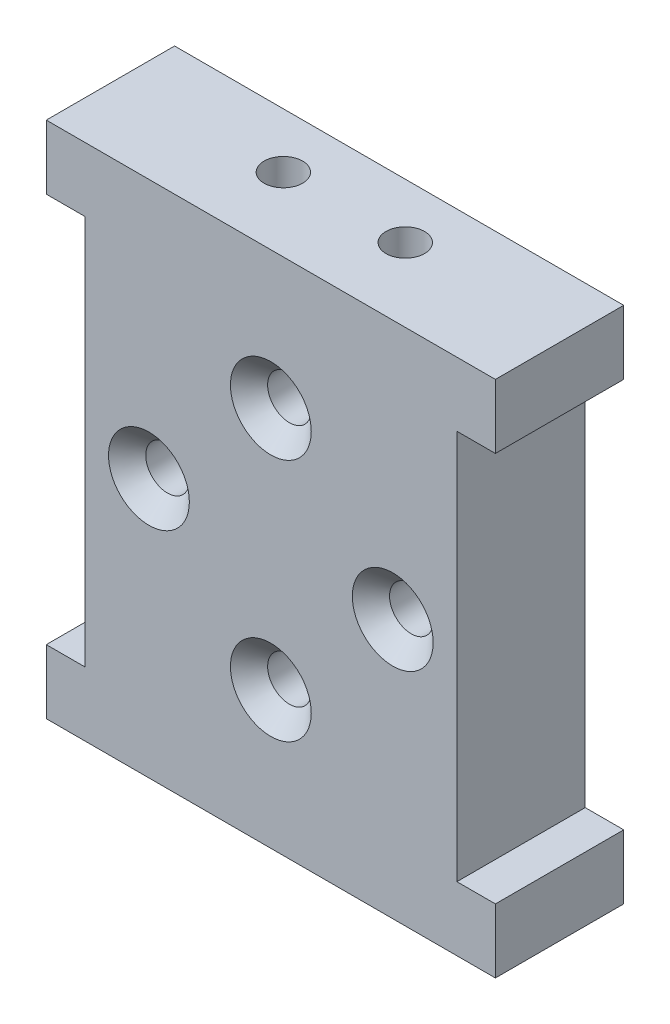
ISO-10303-21;
HEADER;
FILE_DESCRIPTION(('STEP AP214'),'2;1');
FILE_NAME('part.step','',(''),(''),'','','');
FILE_SCHEMA(('AUTOMOTIVE_DESIGN { 1 0 10303 214 1 1 1 1 }'));
ENDSEC;
DATA;
#1=APPLICATION_CONTEXT('core data for automotive mechanical design processes');
#2=APPLICATION_PROTOCOL_DEFINITION('international standard','automotive_design',2000,#1);
#3=PRODUCT_CONTEXT('',#1,'mechanical');
#4=PRODUCT('Part','Part','',(#3));
#5=PRODUCT_RELATED_PRODUCT_CATEGORY('part','',(#4));
#6=PRODUCT_DEFINITION_FORMATION('','',#4);
#7=PRODUCT_DEFINITION_CONTEXT('part definition',#1,'design');
#8=PRODUCT_DEFINITION('design','',#6,#7);
#9=PRODUCT_DEFINITION_SHAPE('','',#8);
#10=(LENGTH_UNIT() NAMED_UNIT(*) SI_UNIT(.MILLI.,.METRE.));
#11=(NAMED_UNIT(*) PLANE_ANGLE_UNIT() SI_UNIT($,.RADIAN.));
#12=(NAMED_UNIT(*) SI_UNIT($,.STERADIAN.) SOLID_ANGLE_UNIT());
#13=UNCERTAINTY_MEASURE_WITH_UNIT(LENGTH_MEASURE(1.E-05),#10,'distance_accuracy_value','');
#14=(GEOMETRIC_REPRESENTATION_CONTEXT(3) GLOBAL_UNCERTAINTY_ASSIGNED_CONTEXT((#13)) GLOBAL_UNIT_ASSIGNED_CONTEXT((#10,
#11,#12)) REPRESENTATION_CONTEXT('',''));
#15=CARTESIAN_POINT('',(0.,0.,0.));
#16=DIRECTION('',(0.,0.,1.));
#17=DIRECTION('',(1.,0.,0.));
#18=AXIS2_PLACEMENT_3D('',#15,#16,#17);
#19=CARTESIAN_POINT('',(-17.5,20.2,5.));
#20=DIRECTION('',(0.,-1.,0.));
#21=DIRECTION('',(1.,0.,0.));
#22=AXIS2_PLACEMENT_3D('',#19,#20,#21);
#23=PLANE('',#22);
#24=DIRECTION('',(-1.,0.,0.));
#25=VECTOR('',#24,1.);
#26=CARTESIAN_POINT('',(-17.5,20.2,-5.));
#27=LINE('',#26,#25);
#28=CARTESIAN_POINT('',(17.5,20.2,-5.));
#29=VERTEX_POINT('',#28);
#30=CARTESIAN_POINT('',(-17.5,20.2,-5.));
#31=VERTEX_POINT('',#30);
#32=EDGE_CURVE('E168',#29,#31,#27,.T.);
#33=ORIENTED_EDGE('',*,*,#32,.T.);
#34=DIRECTION('',(0.,0.,-1.));
#35=VECTOR('',#34,1.);
#36=CARTESIAN_POINT('',(-17.5,20.2,5.));
#37=LINE('',#36,#35);
#38=CARTESIAN_POINT('',(-17.5,20.2,5.));
#39=VERTEX_POINT('',#38);
#40=EDGE_CURVE('E194',#39,#31,#37,.T.);
#41=ORIENTED_EDGE('',*,*,#40,.F.);
#42=DIRECTION('',(-1.,0.,0.));
#43=VECTOR('',#42,1.);
#44=CARTESIAN_POINT('',(-17.5,20.2,5.));
#45=LINE('',#44,#43);
#46=CARTESIAN_POINT('',(17.5,20.2,5.));
#47=VERTEX_POINT('',#46);
#48=EDGE_CURVE('E241',#47,#39,#45,.T.);
#49=ORIENTED_EDGE('',*,*,#48,.F.);
#50=DIRECTION('',(0.,0.,-1.));
#51=VECTOR('',#50,1.);
#52=CARTESIAN_POINT('',(17.5,20.2,5.));
#53=LINE('',#52,#51);
#54=EDGE_CURVE('E197',#47,#29,#53,.T.);
#55=ORIENTED_EDGE('',*,*,#54,.T.);
#56=EDGE_LOOP('',(#33,#41,#49,#55));
#57=FACE_BOUND('',#56,.T.);
#58=CARTESIAN_POINT('',(4.74999999999999,20.2,-0.725000000000035));
#59=DIRECTION('',(0.,1.,0.));
#60=DIRECTION('',(0.,0.,1.));
#61=AXIS2_PLACEMENT_3D('',#58,#59,#60);
#62=CIRCLE('',#61,1.5);
#63=CARTESIAN_POINT('',(4.74999999999999,20.2,0.774999999999961));
#64=VERTEX_POINT('',#63);
#65=EDGE_CURVE('E425',#64,#64,#62,.T.);
#66=ORIENTED_EDGE('',*,*,#65,.F.);
#67=EDGE_LOOP('',(#66));
#68=FACE_BOUND('',#67,.T.);
#69=CARTESIAN_POINT('',(-4.75,20.2,-0.725000000000002));
#70=DIRECTION('',(0.,1.,0.));
#71=DIRECTION('',(0.,0.,1.));
#72=AXIS2_PLACEMENT_3D('',#69,#70,#71);
#73=CIRCLE('',#72,1.5);
#74=CARTESIAN_POINT('',(-4.75,20.2,0.774999999999994));
#75=VERTEX_POINT('',#74);
#76=EDGE_CURVE('E431',#75,#75,#73,.T.);
#77=ORIENTED_EDGE('',*,*,#76,.F.);
#78=EDGE_LOOP('',(#77));
#79=FACE_BOUND('',#78,.T.);
#80=ADVANCED_FACE('F35',(#57,#68,#79),#23,.F.);
#81=CARTESIAN_POINT('',(14.5,-15.2,5.));
#82=DIRECTION('',(0.,-1.,0.));
#83=DIRECTION('',(1.,0.,0.));
#84=AXIS2_PLACEMENT_3D('',#81,#82,#83);
#85=PLANE('',#84);
#86=DIRECTION('',(-1.,0.,0.));
#87=VECTOR('',#86,1.);
#88=CARTESIAN_POINT('',(14.5,-15.2,-5.));
#89=LINE('',#88,#87);
#90=CARTESIAN_POINT('',(17.5,-15.2,-5.));
#91=VERTEX_POINT('',#90);
#92=CARTESIAN_POINT('',(14.5,-15.2,-5.));
#93=VERTEX_POINT('',#92);
#94=EDGE_CURVE('E158',#91,#93,#89,.T.);
#95=ORIENTED_EDGE('',*,*,#94,.T.);
#96=DIRECTION('',(0.,0.,-1.));
#97=VECTOR('',#96,1.);
#98=CARTESIAN_POINT('',(14.5,-15.2,5.));
#99=LINE('',#98,#97);
#100=CARTESIAN_POINT('',(14.5,-15.2,5.));
#101=VERTEX_POINT('',#100);
#102=EDGE_CURVE('E11',#101,#93,#99,.T.);
#103=ORIENTED_EDGE('',*,*,#102,.F.);
#104=DIRECTION('',(-1.,0.,0.));
#105=VECTOR('',#104,1.);
#106=CARTESIAN_POINT('',(14.5,-15.2,5.));
#107=LINE('',#106,#105);
#108=CARTESIAN_POINT('',(17.5,-15.2,5.));
#109=VERTEX_POINT('',#108);
#110=EDGE_CURVE('E181',#109,#101,#107,.T.);
#111=ORIENTED_EDGE('',*,*,#110,.F.);
#112=DIRECTION('',(0.,0.,-1.));
#113=VECTOR('',#112,1.);
#114=CARTESIAN_POINT('',(17.5,-15.2,5.));
#115=LINE('',#114,#113);
#116=EDGE_CURVE('E154',#109,#91,#115,.T.);
#117=ORIENTED_EDGE('',*,*,#116,.T.);
#118=EDGE_LOOP('',(#95,#103,#111,#117));
#119=FACE_BOUND('',#118,.T.);
#120=ADVANCED_FACE('F37',(#119),#85,.F.);
#121=CARTESIAN_POINT('',(14.5,-15.2,5.));
#122=DIRECTION('',(-1.,0.,0.));
#123=DIRECTION('',(0.,-1.,0.));
#124=AXIS2_PLACEMENT_3D('',#121,#122,#123);
#125=PLANE('',#124);
#126=DIRECTION('',(0.,1.,0.));
#127=VECTOR('',#126,1.);
#128=CARTESIAN_POINT('',(14.5,-15.2,-5.));
#129=LINE('',#128,#127);
#130=CARTESIAN_POINT('',(14.5,15.2,-5.));
#131=VERTEX_POINT('',#130);
#132=EDGE_CURVE('E161',#93,#131,#129,.T.);
#133=ORIENTED_EDGE('',*,*,#132,.T.);
#134=DIRECTION('',(0.,0.,-1.));
#135=VECTOR('',#134,1.);
#136=CARTESIAN_POINT('',(14.5,15.2,5.));
#137=LINE('',#136,#135);
#138=CARTESIAN_POINT('',(14.5,15.2,5.));
#139=VERTEX_POINT('',#138);
#140=EDGE_CURVE('E45',#139,#131,#137,.T.);
#141=ORIENTED_EDGE('',*,*,#140,.F.);
#142=DIRECTION('',(0.,1.,0.));
#143=VECTOR('',#142,1.);
#144=CARTESIAN_POINT('',(14.5,-15.2,5.));
#145=LINE('',#144,#143);
#146=EDGE_CURVE('E109',#101,#139,#145,.T.);
#147=ORIENTED_EDGE('',*,*,#146,.F.);
#148=ORIENTED_EDGE('',*,*,#102,.T.);
#149=EDGE_LOOP('',(#133,#141,#147,#148));
#150=FACE_BOUND('',#149,.T.);
#151=ADVANCED_FACE('F283',(#150),#125,.F.);
#152=CARTESIAN_POINT('',(14.5,15.2,5.));
#153=DIRECTION('',(0.,1.,0.));
#154=DIRECTION('',(0.,0.,1.));
#155=AXIS2_PLACEMENT_3D('',#152,#153,#154);
#156=PLANE('',#155);
#157=DIRECTION('',(1.,0.,0.));
#158=VECTOR('',#157,1.);
#159=CARTESIAN_POINT('',(14.5,15.2,-5.));
#160=LINE('',#159,#158);
#161=CARTESIAN_POINT('',(17.5,15.2,-5.));
#162=VERTEX_POINT('',#161);
#163=EDGE_CURVE('E164',#131,#162,#160,.T.);
#164=ORIENTED_EDGE('',*,*,#163,.T.);
#165=DIRECTION('',(0.,0.,-1.));
#166=VECTOR('',#165,1.);
#167=CARTESIAN_POINT('',(17.5,15.2,5.));
#168=LINE('',#167,#166);
#169=CARTESIAN_POINT('',(17.5,15.2,5.));
#170=VERTEX_POINT('',#169);
#171=EDGE_CURVE('E200',#170,#162,#168,.T.);
#172=ORIENTED_EDGE('',*,*,#171,.F.);
#173=DIRECTION('',(1.,0.,0.));
#174=VECTOR('',#173,1.);
#175=CARTESIAN_POINT('',(14.5,15.2,5.));
#176=LINE('',#175,#174);
#177=EDGE_CURVE('E237',#139,#170,#176,.T.);
#178=ORIENTED_EDGE('',*,*,#177,.F.);
#179=ORIENTED_EDGE('',*,*,#140,.T.);
#180=EDGE_LOOP('',(#164,#172,#178,#179));
#181=FACE_BOUND('',#180,.T.);
#182=ADVANCED_FACE('F292',(#181),#156,.F.);
#183=CARTESIAN_POINT('',(17.5,15.2,5.));
#184=DIRECTION('',(-1.,0.,0.));
#185=DIRECTION('',(0.,-1.,0.));
#186=AXIS2_PLACEMENT_3D('',#183,#184,#185);
#187=PLANE('',#186);
#188=DIRECTION('',(0.,1.,0.));
#189=VECTOR('',#188,1.);
#190=CARTESIAN_POINT('',(17.5,15.2,-5.));
#191=LINE('',#190,#189);
#192=EDGE_CURVE('E166',#162,#29,#191,.T.);
#193=ORIENTED_EDGE('',*,*,#192,.T.);
#194=ORIENTED_EDGE('',*,*,#54,.F.);
#195=DIRECTION('',(0.,1.,0.));
#196=VECTOR('',#195,1.);
#197=CARTESIAN_POINT('',(17.5,15.2,5.));
#198=LINE('',#197,#196);
#199=EDGE_CURVE('E239',#170,#47,#198,.T.);
#200=ORIENTED_EDGE('',*,*,#199,.F.);
#201=ORIENTED_EDGE('',*,*,#171,.T.);
#202=EDGE_LOOP('',(#193,#194,#200,#201));
#203=FACE_BOUND('',#202,.T.);
#204=ADVANCED_FACE('F289',(#203),#187,.F.);
#205=CARTESIAN_POINT('',(-17.5,15.2,5.));
#206=DIRECTION('',(1.,0.,0.));
#207=DIRECTION('',(0.,0.,-1.));
#208=AXIS2_PLACEMENT_3D('',#205,#206,#207);
#209=PLANE('',#208);
#210=DIRECTION('',(0.,-1.,0.));
#211=VECTOR('',#210,1.);
#212=CARTESIAN_POINT('',(-17.5,15.2,-5.));
#213=LINE('',#212,#211);
#214=CARTESIAN_POINT('',(-17.5,15.2,-5.));
#215=VERTEX_POINT('',#214);
#216=EDGE_CURVE('E170',#31,#215,#213,.T.);
#217=ORIENTED_EDGE('',*,*,#216,.T.);
#218=DIRECTION('',(0.,0.,-1.));
#219=VECTOR('',#218,1.);
#220=CARTESIAN_POINT('',(-17.5,15.2,5.));
#221=LINE('',#220,#219);
#222=CARTESIAN_POINT('',(-17.5,15.2,5.));
#223=VERTEX_POINT('',#222);
#224=EDGE_CURVE('E191',#223,#215,#221,.T.);
#225=ORIENTED_EDGE('',*,*,#224,.F.);
#226=DIRECTION('',(0.,-1.,0.));
#227=VECTOR('',#226,1.);
#228=CARTESIAN_POINT('',(-17.5,15.2,5.));
#229=LINE('',#228,#227);
#230=EDGE_CURVE('E243',#39,#223,#229,.T.);
#231=ORIENTED_EDGE('',*,*,#230,.F.);
#232=ORIENTED_EDGE('',*,*,#40,.T.);
#233=EDGE_LOOP('',(#217,#225,#231,#232));
#234=FACE_BOUND('',#233,.T.);
#235=ADVANCED_FACE('F287',(#234),#209,.F.);
#236=CARTESIAN_POINT('',(-14.5,15.2,5.));
#237=DIRECTION('',(0.,1.,0.));
#238=DIRECTION('',(-1.,0.,0.));
#239=AXIS2_PLACEMENT_3D('',#236,#237,#238);
#240=PLANE('',#239);
#241=DIRECTION('',(1.,0.,0.));
#242=VECTOR('',#241,1.);
#243=CARTESIAN_POINT('',(-14.5,15.2,-5.));
#244=LINE('',#243,#242);
#245=CARTESIAN_POINT('',(-14.5,15.2,-5.));
#246=VERTEX_POINT('',#245);
#247=EDGE_CURVE('E172',#215,#246,#244,.T.);
#248=ORIENTED_EDGE('',*,*,#247,.T.);
#249=DIRECTION('',(0.,0.,-1.));
#250=VECTOR('',#249,1.);
#251=CARTESIAN_POINT('',(-14.5,15.2,5.));
#252=LINE('',#251,#250);
#253=CARTESIAN_POINT('',(-14.5,15.2,5.));
#254=VERTEX_POINT('',#253);
#255=EDGE_CURVE('E188',#254,#246,#252,.T.);
#256=ORIENTED_EDGE('',*,*,#255,.F.);
#257=DIRECTION('',(1.,0.,0.));
#258=VECTOR('',#257,1.);
#259=CARTESIAN_POINT('',(-14.5,15.2,5.));
#260=LINE('',#259,#258);
#261=EDGE_CURVE('E245',#223,#254,#260,.T.);
#262=ORIENTED_EDGE('',*,*,#261,.F.);
#263=ORIENTED_EDGE('',*,*,#224,.T.);
#264=EDGE_LOOP('',(#248,#256,#262,#263));
#265=FACE_BOUND('',#264,.T.);
#266=ADVANCED_FACE('F313',(#265),#240,.F.);
#267=CARTESIAN_POINT('',(-14.5,-15.2,5.));
#268=DIRECTION('',(1.,0.,0.));
#269=DIRECTION('',(0.,1.,0.));
#270=AXIS2_PLACEMENT_3D('',#267,#268,#269);
#271=PLANE('',#270);
#272=DIRECTION('',(0.,-1.,0.));
#273=VECTOR('',#272,1.);
#274=CARTESIAN_POINT('',(-14.5,-15.2,-5.));
#275=LINE('',#274,#273);
#276=CARTESIAN_POINT('',(-14.5,-15.2,-5.));
#277=VERTEX_POINT('',#276);
#278=EDGE_CURVE('E174',#246,#277,#275,.T.);
#279=ORIENTED_EDGE('',*,*,#278,.T.);
#280=DIRECTION('',(0.,0.,-1.));
#281=VECTOR('',#280,1.);
#282=CARTESIAN_POINT('',(-14.5,-15.2,5.));
#283=LINE('',#282,#281);
#284=CARTESIAN_POINT('',(-14.5,-15.2,5.));
#285=VERTEX_POINT('',#284);
#286=EDGE_CURVE('E185',#285,#277,#283,.T.);
#287=ORIENTED_EDGE('',*,*,#286,.F.);
#288=DIRECTION('',(0.,-1.,0.));
#289=VECTOR('',#288,1.);
#290=CARTESIAN_POINT('',(-14.5,-15.2,5.));
#291=LINE('',#290,#289);
#292=EDGE_CURVE('E247',#254,#285,#291,.T.);
#293=ORIENTED_EDGE('',*,*,#292,.F.);
#294=ORIENTED_EDGE('',*,*,#255,.T.);
#295=EDGE_LOOP('',(#279,#287,#293,#294));
#296=FACE_BOUND('',#295,.T.);
#297=ADVANCED_FACE('F253',(#296),#271,.F.);
#298=CARTESIAN_POINT('',(-14.5,-15.2,5.));
#299=DIRECTION('',(0.,-1.,0.));
#300=DIRECTION('',(1.,0.,0.));
#301=AXIS2_PLACEMENT_3D('',#298,#299,#300);
#302=PLANE('',#301);
#303=DIRECTION('',(-1.,0.,0.));
#304=VECTOR('',#303,1.);
#305=CARTESIAN_POINT('',(-14.5,-15.2,-5.));
#306=LINE('',#305,#304);
#307=CARTESIAN_POINT('',(-17.5,-15.2,-5.));
#308=VERTEX_POINT('',#307);
#309=EDGE_CURVE('E176',#277,#308,#306,.T.);
#310=ORIENTED_EDGE('',*,*,#309,.T.);
#311=DIRECTION('',(0.,0.,-1.));
#312=VECTOR('',#311,1.);
#313=CARTESIAN_POINT('',(-17.5,-15.2,5.));
#314=LINE('',#313,#312);
#315=CARTESIAN_POINT('',(-17.5,-15.2,5.));
#316=VERTEX_POINT('',#315);
#317=EDGE_CURVE('E149',#316,#308,#314,.T.);
#318=ORIENTED_EDGE('',*,*,#317,.F.);
#319=DIRECTION('',(-1.,0.,0.));
#320=VECTOR('',#319,1.);
#321=CARTESIAN_POINT('',(-14.5,-15.2,5.));
#322=LINE('',#321,#320);
#323=EDGE_CURVE('E140',#285,#316,#322,.T.);
#324=ORIENTED_EDGE('',*,*,#323,.F.);
#325=ORIENTED_EDGE('',*,*,#286,.T.);
#326=EDGE_LOOP('',(#310,#318,#324,#325));
#327=FACE_BOUND('',#326,.T.);
#328=ADVANCED_FACE('F257',(#327),#302,.F.);
#329=CARTESIAN_POINT('',(-17.5,-15.2,5.));
#330=DIRECTION('',(1.,0.,0.));
#331=DIRECTION('',(0.,0.,-1.));
#332=AXIS2_PLACEMENT_3D('',#329,#330,#331);
#333=PLANE('',#332);
#334=DIRECTION('',(0.,-1.,0.));
#335=VECTOR('',#334,1.);
#336=CARTESIAN_POINT('',(-17.5,-15.2,-5.));
#337=LINE('',#336,#335);
#338=CARTESIAN_POINT('',(-17.5,-20.2,-5.));
#339=VERTEX_POINT('',#338);
#340=EDGE_CURVE('E148',#308,#339,#337,.T.);
#341=ORIENTED_EDGE('',*,*,#340,.T.);
#342=DIRECTION('',(0.,0.,-1.));
#343=VECTOR('',#342,1.);
#344=CARTESIAN_POINT('',(-17.5,-20.2,5.));
#345=LINE('',#344,#343);
#346=CARTESIAN_POINT('',(-17.5,-20.2,5.));
#347=VERTEX_POINT('',#346);
#348=EDGE_CURVE('E145',#347,#339,#345,.T.);
#349=ORIENTED_EDGE('',*,*,#348,.F.);
#350=DIRECTION('',(0.,-1.,0.));
#351=VECTOR('',#350,1.);
#352=CARTESIAN_POINT('',(-17.5,-15.2,5.));
#353=LINE('',#352,#351);
#354=EDGE_CURVE('E134',#316,#347,#353,.T.);
#355=ORIENTED_EDGE('',*,*,#354,.F.);
#356=ORIENTED_EDGE('',*,*,#317,.T.);
#357=EDGE_LOOP('',(#341,#349,#355,#356));
#358=FACE_BOUND('',#357,.T.);
#359=ADVANCED_FACE('F146',(#358),#333,.F.);
#360=CARTESIAN_POINT('',(-17.5,-20.2,5.));
#361=DIRECTION('',(0.,1.,0.));
#362=DIRECTION('',(-1.,0.,0.));
#363=AXIS2_PLACEMENT_3D('',#360,#361,#362);
#364=PLANE('',#363);
#365=CARTESIAN_POINT('',(-4.75,-20.2,-0.725000000000002));
#366=DIRECTION('',(0.,1.,0.));
#367=DIRECTION('',(-1.,0.,0.));
#368=AXIS2_PLACEMENT_3D('',#365,#366,#367);
#369=CIRCLE('',#368,1.49999999999999);
#370=CARTESIAN_POINT('',(-6.25,-20.2,-0.725000000000002));
#371=VERTEX_POINT('',#370);
#372=EDGE_CURVE('E428',#371,#371,#369,.T.);
#373=ORIENTED_EDGE('',*,*,#372,.T.);
#374=EDGE_LOOP('',(#373));
#375=FACE_BOUND('',#374,.T.);
#376=CARTESIAN_POINT('',(4.74999999999999,-20.2,-0.725000000000035));
#377=DIRECTION('',(0.,1.,0.));
#378=DIRECTION('',(-1.,0.,0.));
#379=AXIS2_PLACEMENT_3D('',#376,#377,#378);
#380=CIRCLE('',#379,1.49999999999999);
#381=CARTESIAN_POINT('',(3.25,-20.2,-0.725000000000035));
#382=VERTEX_POINT('',#381);
#383=EDGE_CURVE('E420',#382,#382,#380,.T.);
#384=ORIENTED_EDGE('',*,*,#383,.T.);
#385=EDGE_LOOP('',(#384));
#386=FACE_BOUND('',#385,.T.);
#387=DIRECTION('',(1.,0.,0.));
#388=VECTOR('',#387,1.);
#389=CARTESIAN_POINT('',(-17.5,-20.2,-5.));
#390=LINE('',#389,#388);
#391=CARTESIAN_POINT('',(17.5,-20.2,-5.));
#392=VERTEX_POINT('',#391);
#393=EDGE_CURVE('E95',#339,#392,#390,.T.);
#394=ORIENTED_EDGE('',*,*,#393,.T.);
#395=DIRECTION('',(0.,0.,-1.));
#396=VECTOR('',#395,1.);
#397=CARTESIAN_POINT('',(17.5,-20.2,5.));
#398=LINE('',#397,#396);
#399=CARTESIAN_POINT('',(17.5,-20.2,5.));
#400=VERTEX_POINT('',#399);
#401=EDGE_CURVE('E150',#400,#392,#398,.T.);
#402=ORIENTED_EDGE('',*,*,#401,.F.);
#403=DIRECTION('',(1.,0.,0.));
#404=VECTOR('',#403,1.);
#405=CARTESIAN_POINT('',(-17.5,-20.2,5.));
#406=LINE('',#405,#404);
#407=EDGE_CURVE('E138',#347,#400,#406,.T.);
#408=ORIENTED_EDGE('',*,*,#407,.F.);
#409=ORIENTED_EDGE('',*,*,#348,.T.);
#410=EDGE_LOOP('',(#394,#402,#408,#409));
#411=FACE_BOUND('',#410,.T.);
#412=ADVANCED_FACE('F152',(#375,#386,#411),#364,.F.);
#413=CARTESIAN_POINT('',(17.5,-15.2,5.));
#414=DIRECTION('',(-1.,0.,0.));
#415=DIRECTION('',(0.,-1.,0.));
#416=AXIS2_PLACEMENT_3D('',#413,#414,#415);
#417=PLANE('',#416);
#418=DIRECTION('',(0.,1.,0.));
#419=VECTOR('',#418,1.);
#420=CARTESIAN_POINT('',(17.5,-15.2,-5.));
#421=LINE('',#420,#419);
#422=EDGE_CURVE('E101',#392,#91,#421,.T.);
#423=ORIENTED_EDGE('',*,*,#422,.T.);
#424=ORIENTED_EDGE('',*,*,#116,.F.);
#425=DIRECTION('',(0.,1.,0.));
#426=VECTOR('',#425,1.);
#427=CARTESIAN_POINT('',(17.5,-15.2,5.));
#428=LINE('',#427,#426);
#429=EDGE_CURVE('E54',#400,#109,#428,.T.);
#430=ORIENTED_EDGE('',*,*,#429,.F.);
#431=ORIENTED_EDGE('',*,*,#401,.T.);
#432=EDGE_LOOP('',(#423,#424,#430,#431));
#433=FACE_BOUND('',#432,.T.);
#434=ADVANCED_FACE('F265',(#433),#417,.F.);
#435=CARTESIAN_POINT('',(0.,0.,5.));
#436=DIRECTION('',(0.,0.,-1.));
#437=DIRECTION('',(-1.,0.,0.));
#438=AXIS2_PLACEMENT_3D('',#435,#436,#437);
#439=PLANE('',#438);
#440=CARTESIAN_POINT('',(-9.5,0.,5.));
#441=DIRECTION('',(0.,0.,1.));
#442=DIRECTION('',(1.,0.,0.));
#443=AXIS2_PLACEMENT_3D('',#440,#441,#442);
#444=CIRCLE('',#443,3.15);
#445=CARTESIAN_POINT('',(-6.35,0.,5.));
#446=VERTEX_POINT('',#445);
#447=EDGE_CURVE('E416',#446,#446,#444,.T.);
#448=ORIENTED_EDGE('',*,*,#447,.F.);
#449=EDGE_LOOP('',(#448));
#450=FACE_BOUND('',#449,.T.);
#451=CARTESIAN_POINT('',(0.,9.5,5.));
#452=DIRECTION('',(0.,0.,1.));
#453=DIRECTION('',(1.,0.,0.));
#454=AXIS2_PLACEMENT_3D('',#451,#452,#453);
#455=CIRCLE('',#454,3.15);
#456=CARTESIAN_POINT('',(3.15,9.5,5.));
#457=VERTEX_POINT('',#456);
#458=EDGE_CURVE('E221',#457,#457,#455,.T.);
#459=ORIENTED_EDGE('',*,*,#458,.F.);
#460=EDGE_LOOP('',(#459));
#461=FACE_BOUND('',#460,.T.);
#462=CARTESIAN_POINT('',(9.5,0.,5.));
#463=DIRECTION('',(0.,0.,1.));
#464=DIRECTION('',(1.,0.,0.));
#465=AXIS2_PLACEMENT_3D('',#462,#463,#464);
#466=CIRCLE('',#465,3.15);
#467=CARTESIAN_POINT('',(12.65,0.,5.));
#468=VERTEX_POINT('',#467);
#469=EDGE_CURVE('E214',#468,#468,#466,.T.);
#470=ORIENTED_EDGE('',*,*,#469,.F.);
#471=EDGE_LOOP('',(#470));
#472=FACE_BOUND('',#471,.T.);
#473=CARTESIAN_POINT('',(0.,-9.5,5.));
#474=DIRECTION('',(0.,0.,1.));
#475=DIRECTION('',(1.,0.,0.));
#476=AXIS2_PLACEMENT_3D('',#473,#474,#475);
#477=CIRCLE('',#476,3.15);
#478=CARTESIAN_POINT('',(3.15,-9.5,5.));
#479=VERTEX_POINT('',#478);
#480=EDGE_CURVE('E210',#479,#479,#477,.T.);
#481=ORIENTED_EDGE('',*,*,#480,.F.);
#482=EDGE_LOOP('',(#481));
#483=FACE_BOUND('',#482,.T.);
#484=ORIENTED_EDGE('',*,*,#110,.T.);
#485=ORIENTED_EDGE('',*,*,#146,.T.);
#486=ORIENTED_EDGE('',*,*,#177,.T.);
#487=ORIENTED_EDGE('',*,*,#199,.T.);
#488=ORIENTED_EDGE('',*,*,#48,.T.);
#489=ORIENTED_EDGE('',*,*,#230,.T.);
#490=ORIENTED_EDGE('',*,*,#261,.T.);
#491=ORIENTED_EDGE('',*,*,#292,.T.);
#492=ORIENTED_EDGE('',*,*,#323,.T.);
#493=ORIENTED_EDGE('',*,*,#354,.T.);
#494=ORIENTED_EDGE('',*,*,#407,.T.);
#495=ORIENTED_EDGE('',*,*,#429,.T.);
#496=EDGE_LOOP('',(#484,#485,#486,#487,#488,#489,#490,#491,#492,#493,#494,#495));
#497=FACE_BOUND('',#496,.T.);
#498=ADVANCED_FACE('F136',(#450,#461,#472,#483,#497),#439,.F.);
#499=CARTESIAN_POINT('',(0.,0.,-5.));
#500=DIRECTION('',(0.,0.,-1.));
#501=DIRECTION('',(-1.,0.,0.));
#502=AXIS2_PLACEMENT_3D('',#499,#500,#501);
#503=PLANE('',#502);
#504=CARTESIAN_POINT('',(-9.5,0.,-5.));
#505=DIRECTION('',(0.,0.,-1.));
#506=DIRECTION('',(-1.,0.,0.));
#507=AXIS2_PLACEMENT_3D('',#504,#505,#506);
#508=CIRCLE('',#507,1.7);
#509=CARTESIAN_POINT('',(-11.2,0.,-5.));
#510=VERTEX_POINT('',#509);
#511=EDGE_CURVE('E39',#510,#510,#508,.T.);
#512=ORIENTED_EDGE('',*,*,#511,.F.);
#513=EDGE_LOOP('',(#512));
#514=FACE_BOUND('',#513,.T.);
#515=CARTESIAN_POINT('',(0.,9.5,-5.));
#516=DIRECTION('',(0.,0.,-1.));
#517=DIRECTION('',(-1.,0.,0.));
#518=AXIS2_PLACEMENT_3D('',#515,#516,#517);
#519=CIRCLE('',#518,1.7);
#520=CARTESIAN_POINT('',(-1.7,9.5,-5.));
#521=VERTEX_POINT('',#520);
#522=EDGE_CURVE('E212',#521,#521,#519,.T.);
#523=ORIENTED_EDGE('',*,*,#522,.F.);
#524=EDGE_LOOP('',(#523));
#525=FACE_BOUND('',#524,.T.);
#526=CARTESIAN_POINT('',(9.5,0.,-5.));
#527=DIRECTION('',(0.,0.,-1.));
#528=DIRECTION('',(-1.,0.,0.));
#529=AXIS2_PLACEMENT_3D('',#526,#527,#528);
#530=CIRCLE('',#529,1.7);
#531=CARTESIAN_POINT('',(7.8,0.,-5.));
#532=VERTEX_POINT('',#531);
#533=EDGE_CURVE('E208',#532,#532,#530,.T.);
#534=ORIENTED_EDGE('',*,*,#533,.F.);
#535=EDGE_LOOP('',(#534));
#536=FACE_BOUND('',#535,.T.);
#537=CARTESIAN_POINT('',(0.,-9.5,-5.));
#538=DIRECTION('',(0.,0.,-1.));
#539=DIRECTION('',(-1.,0.,0.));
#540=AXIS2_PLACEMENT_3D('',#537,#538,#539);
#541=CIRCLE('',#540,1.7);
#542=CARTESIAN_POINT('',(-1.7,-9.5,-5.));
#543=VERTEX_POINT('',#542);
#544=EDGE_CURVE('E162',#543,#543,#541,.T.);
#545=ORIENTED_EDGE('',*,*,#544,.F.);
#546=EDGE_LOOP('',(#545));
#547=FACE_BOUND('',#546,.T.);
#548=ORIENTED_EDGE('',*,*,#94,.F.);
#549=ORIENTED_EDGE('',*,*,#422,.F.);
#550=ORIENTED_EDGE('',*,*,#393,.F.);
#551=ORIENTED_EDGE('',*,*,#340,.F.);
#552=ORIENTED_EDGE('',*,*,#309,.F.);
#553=ORIENTED_EDGE('',*,*,#278,.F.);
#554=ORIENTED_EDGE('',*,*,#247,.F.);
#555=ORIENTED_EDGE('',*,*,#216,.F.);
#556=ORIENTED_EDGE('',*,*,#32,.F.);
#557=ORIENTED_EDGE('',*,*,#192,.F.);
#558=ORIENTED_EDGE('',*,*,#163,.F.);
#559=ORIENTED_EDGE('',*,*,#132,.F.);
#560=EDGE_LOOP('',(#548,#549,#550,#551,#552,#553,#554,#555,#556,#557,#558,#559));
#561=FACE_BOUND('',#560,.T.);
#562=ADVANCED_FACE('F260',(#514,#525,#536,#547,#561),#503,.T.);
#563=CARTESIAN_POINT('',(0.,-9.5,5.));
#564=DIRECTION('',(0.,0.,1.));
#565=DIRECTION('',(1.,0.,0.));
#566=AXIS2_PLACEMENT_3D('',#563,#564,#565);
#567=CYLINDRICAL_SURFACE('',#566,1.7);
#568=ORIENTED_EDGE('',*,*,#544,.T.);
#569=EDGE_LOOP('',(#568));
#570=FACE_BOUND('',#569,.T.);
#571=CARTESIAN_POINT('',(0.,-9.5,3.55));
#572=DIRECTION('',(0.,0.,1.));
#573=DIRECTION('',(1.,0.,0.));
#574=AXIS2_PLACEMENT_3D('',#571,#572,#573);
#575=CIRCLE('',#574,1.7);
#576=CARTESIAN_POINT('',(1.7,-9.5,3.55));
#577=VERTEX_POINT('',#576);
#578=EDGE_CURVE('E207',#577,#577,#575,.T.);
#579=ORIENTED_EDGE('',*,*,#578,.T.);
#580=EDGE_LOOP('',(#579));
#581=FACE_BOUND('',#580,.T.);
#582=ADVANCED_FACE('F389',(#570,#581),#567,.F.);
#583=CARTESIAN_POINT('',(0.,-9.5,5.));
#584=DIRECTION('',(0.,0.,1.));
#585=DIRECTION('',(1.,0.,0.));
#586=AXIS2_PLACEMENT_3D('',#583,#584,#585);
#587=CONICAL_SURFACE('',#586,3.15,0.785398163397448);
#588=ORIENTED_EDGE('',*,*,#578,.F.);
#589=EDGE_LOOP('',(#588));
#590=FACE_BOUND('',#589,.T.);
#591=ORIENTED_EDGE('',*,*,#480,.T.);
#592=EDGE_LOOP('',(#591));
#593=FACE_BOUND('',#592,.T.);
#594=ADVANCED_FACE('F385',(#590,#593),#587,.F.);
#595=CARTESIAN_POINT('',(9.5,0.,5.));
#596=DIRECTION('',(0.,0.,1.));
#597=DIRECTION('',(1.,0.,0.));
#598=AXIS2_PLACEMENT_3D('',#595,#596,#597);
#599=CYLINDRICAL_SURFACE('',#598,1.7);
#600=ORIENTED_EDGE('',*,*,#533,.T.);
#601=EDGE_LOOP('',(#600));
#602=FACE_BOUND('',#601,.T.);
#603=CARTESIAN_POINT('',(9.5,0.,3.55));
#604=DIRECTION('',(0.,0.,1.));
#605=DIRECTION('',(1.,0.,0.));
#606=AXIS2_PLACEMENT_3D('',#603,#604,#605);
#607=CIRCLE('',#606,1.7);
#608=CARTESIAN_POINT('',(11.2,0.,3.55));
#609=VERTEX_POINT('',#608);
#610=EDGE_CURVE('E211',#609,#609,#607,.T.);
#611=ORIENTED_EDGE('',*,*,#610,.T.);
#612=EDGE_LOOP('',(#611));
#613=FACE_BOUND('',#612,.T.);
#614=ADVANCED_FACE('F381',(#602,#613),#599,.F.);
#615=CARTESIAN_POINT('',(9.5,0.,5.));
#616=DIRECTION('',(0.,0.,1.));
#617=DIRECTION('',(1.,0.,0.));
#618=AXIS2_PLACEMENT_3D('',#615,#616,#617);
#619=CONICAL_SURFACE('',#618,3.15,0.785398163397448);
#620=ORIENTED_EDGE('',*,*,#610,.F.);
#621=EDGE_LOOP('',(#620));
#622=FACE_BOUND('',#621,.T.);
#623=ORIENTED_EDGE('',*,*,#469,.T.);
#624=EDGE_LOOP('',(#623));
#625=FACE_BOUND('',#624,.T.);
#626=ADVANCED_FACE('F378',(#622,#625),#619,.F.);
#627=CARTESIAN_POINT('',(0.,9.5,5.));
#628=DIRECTION('',(0.,0.,1.));
#629=DIRECTION('',(1.,0.,0.));
#630=AXIS2_PLACEMENT_3D('',#627,#628,#629);
#631=CYLINDRICAL_SURFACE('',#630,1.7);
#632=ORIENTED_EDGE('',*,*,#522,.T.);
#633=EDGE_LOOP('',(#632));
#634=FACE_BOUND('',#633,.T.);
#635=CARTESIAN_POINT('',(0.,9.5,3.55));
#636=DIRECTION('',(0.,0.,1.));
#637=DIRECTION('',(1.,0.,0.));
#638=AXIS2_PLACEMENT_3D('',#635,#636,#637);
#639=CIRCLE('',#638,1.7);
#640=CARTESIAN_POINT('',(1.69999999999999,9.5,3.55));
#641=VERTEX_POINT('',#640);
#642=EDGE_CURVE('E215',#641,#641,#639,.T.);
#643=ORIENTED_EDGE('',*,*,#642,.T.);
#644=EDGE_LOOP('',(#643));
#645=FACE_BOUND('',#644,.T.);
#646=ADVANCED_FACE('F374',(#634,#645),#631,.F.);
#647=CARTESIAN_POINT('',(0.,9.5,5.));
#648=DIRECTION('',(0.,0.,1.));
#649=DIRECTION('',(1.,0.,0.));
#650=AXIS2_PLACEMENT_3D('',#647,#648,#649);
#651=CONICAL_SURFACE('',#650,3.15,0.785398163397448);
#652=ORIENTED_EDGE('',*,*,#642,.F.);
#653=EDGE_LOOP('',(#652));
#654=FACE_BOUND('',#653,.T.);
#655=ORIENTED_EDGE('',*,*,#458,.T.);
#656=EDGE_LOOP('',(#655));
#657=FACE_BOUND('',#656,.T.);
#658=ADVANCED_FACE('F370',(#654,#657),#651,.F.);
#659=CARTESIAN_POINT('',(-9.5,0.,5.));
#660=DIRECTION('',(0.,0.,1.));
#661=DIRECTION('',(1.,0.,0.));
#662=AXIS2_PLACEMENT_3D('',#659,#660,#661);
#663=CYLINDRICAL_SURFACE('',#662,1.7);
#664=ORIENTED_EDGE('',*,*,#511,.T.);
#665=EDGE_LOOP('',(#664));
#666=FACE_BOUND('',#665,.T.);
#667=CARTESIAN_POINT('',(-9.5,0.,3.55));
#668=DIRECTION('',(0.,0.,1.));
#669=DIRECTION('',(1.,0.,0.));
#670=AXIS2_PLACEMENT_3D('',#667,#668,#669);
#671=CIRCLE('',#670,1.7);
#672=CARTESIAN_POINT('',(-7.8,0.,3.55));
#673=VERTEX_POINT('',#672);
#674=EDGE_CURVE('E414',#673,#673,#671,.T.);
#675=ORIENTED_EDGE('',*,*,#674,.T.);
#676=EDGE_LOOP('',(#675));
#677=FACE_BOUND('',#676,.T.);
#678=ADVANCED_FACE('F366',(#666,#677),#663,.F.);
#679=CARTESIAN_POINT('',(-9.5,0.,5.));
#680=DIRECTION('',(0.,0.,1.));
#681=DIRECTION('',(1.,0.,0.));
#682=AXIS2_PLACEMENT_3D('',#679,#680,#681);
#683=CONICAL_SURFACE('',#682,3.15,0.785398163397448);
#684=ORIENTED_EDGE('',*,*,#674,.F.);
#685=EDGE_LOOP('',(#684));
#686=FACE_BOUND('',#685,.T.);
#687=ORIENTED_EDGE('',*,*,#447,.T.);
#688=EDGE_LOOP('',(#687));
#689=FACE_BOUND('',#688,.T.);
#690=ADVANCED_FACE('F347',(#686,#689),#683,.F.);
#691=CARTESIAN_POINT('',(4.74999999999999,20.2,-0.725000000000035));
#692=DIRECTION('',(0.,1.,0.));
#693=DIRECTION('',(0.,0.,1.));
#694=AXIS2_PLACEMENT_3D('',#691,#692,#693);
#695=CYLINDRICAL_SURFACE('',#694,1.49999999999999);
#696=ORIENTED_EDGE('',*,*,#383,.F.);
#697=EDGE_LOOP('',(#696));
#698=FACE_BOUND('',#697,.T.);
#699=ORIENTED_EDGE('',*,*,#65,.T.);
#700=EDGE_LOOP('',(#699));
#701=FACE_BOUND('',#700,.T.);
#702=ADVANCED_FACE('F341',(#698,#701),#695,.F.);
#703=CARTESIAN_POINT('',(-4.75,20.2,-0.725000000000002));
#704=DIRECTION('',(0.,1.,0.));
#705=DIRECTION('',(0.,0.,1.));
#706=AXIS2_PLACEMENT_3D('',#703,#704,#705);
#707=CYLINDRICAL_SURFACE('',#706,1.49999999999999);
#708=ORIENTED_EDGE('',*,*,#372,.F.);
#709=EDGE_LOOP('',(#708));
#710=FACE_BOUND('',#709,.T.);
#711=ORIENTED_EDGE('',*,*,#76,.T.);
#712=EDGE_LOOP('',(#711));
#713=FACE_BOUND('',#712,.T.);
#714=ADVANCED_FACE('F346',(#710,#713),#707,.F.);
#715=CLOSED_SHELL('',(#80,#120,#151,#182,#204,#235,#266,#297,#328,#359,#412,#434,#498,#562,#582,
#594,#614,#626,#646,#658,#678,#690,#702,#714));
#716=MANIFOLD_SOLID_BREP('B2',#715);
#717=ADVANCED_BREP_SHAPE_REPRESENTATION('',(#18,#716),#14);
#718=SHAPE_DEFINITION_REPRESENTATION(#9,#717);
ENDSEC;
END-ISO-10303-21;
